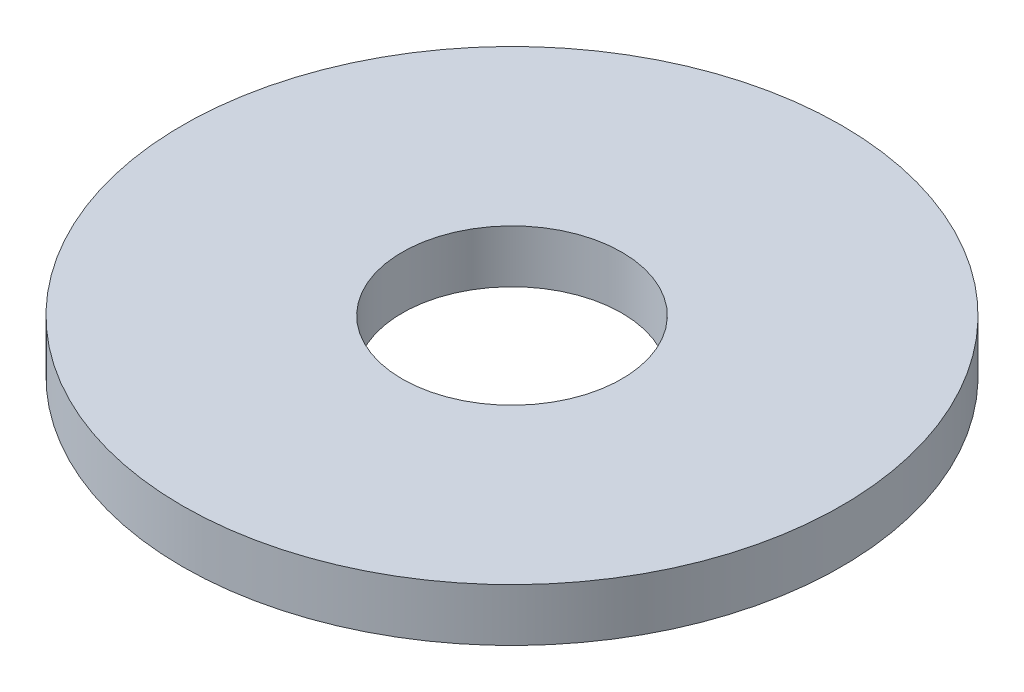
ISO-10303-21;
HEADER;
FILE_DESCRIPTION(('STEP AP214'),'2;1');
FILE_NAME('part.step','',(''),(''),'','','');
FILE_SCHEMA(('AUTOMOTIVE_DESIGN { 1 0 10303 214 1 1 1 1 }'));
ENDSEC;
DATA;
#1=APPLICATION_CONTEXT('core data for automotive mechanical design processes');
#2=APPLICATION_PROTOCOL_DEFINITION('international standard','automotive_design',2000,#1);
#3=PRODUCT_CONTEXT('',#1,'mechanical');
#4=PRODUCT('Part','Part','',(#3));
#5=PRODUCT_RELATED_PRODUCT_CATEGORY('part','',(#4));
#6=PRODUCT_DEFINITION_FORMATION('','',#4);
#7=PRODUCT_DEFINITION_CONTEXT('part definition',#1,'design');
#8=PRODUCT_DEFINITION('design','',#6,#7);
#9=PRODUCT_DEFINITION_SHAPE('','',#8);
#10=(LENGTH_UNIT() NAMED_UNIT(*) SI_UNIT(.MILLI.,.METRE.));
#11=(NAMED_UNIT(*) PLANE_ANGLE_UNIT() SI_UNIT($,.RADIAN.));
#12=(NAMED_UNIT(*) SI_UNIT($,.STERADIAN.) SOLID_ANGLE_UNIT());
#13=UNCERTAINTY_MEASURE_WITH_UNIT(LENGTH_MEASURE(1.E-05),#10,'distance_accuracy_value','');
#14=(GEOMETRIC_REPRESENTATION_CONTEXT(3) GLOBAL_UNCERTAINTY_ASSIGNED_CONTEXT((#13)) GLOBAL_UNIT_ASSIGNED_CONTEXT((#10,
#11,#12)) REPRESENTATION_CONTEXT('',''));
#15=CARTESIAN_POINT('',(0.,0.,0.));
#16=DIRECTION('',(0.,0.,1.));
#17=DIRECTION('',(1.,0.,0.));
#18=AXIS2_PLACEMENT_3D('',#15,#16,#17);
#19=CARTESIAN_POINT('',(0.,1.2,0.));
#20=DIRECTION('',(0.,1.,0.));
#21=DIRECTION('',(0.,0.,1.));
#22=AXIS2_PLACEMENT_3D('',#19,#20,#21);
#23=PLANE('',#22);
#24=CARTESIAN_POINT('',(0.,1.2,0.));
#25=DIRECTION('',(0.,1.,0.));
#26=DIRECTION('',(0.,0.,1.));
#27=AXIS2_PLACEMENT_3D('',#24,#25,#26);
#28=CIRCLE('',#27,7.5);
#29=CARTESIAN_POINT('',(0.,1.2,7.5));
#30=VERTEX_POINT('',#29);
#31=EDGE_CURVE('E10',#30,#30,#28,.T.);
#32=ORIENTED_EDGE('',*,*,#31,.T.);
#33=EDGE_LOOP('',(#32));
#34=FACE_BOUND('',#33,.T.);
#35=CARTESIAN_POINT('',(0.,1.2,0.));
#36=DIRECTION('',(0.,1.,0.));
#37=DIRECTION('',(0.,0.,1.));
#38=AXIS2_PLACEMENT_3D('',#35,#36,#37);
#39=CIRCLE('',#38,2.5);
#40=CARTESIAN_POINT('',(0.,1.2,2.5));
#41=VERTEX_POINT('',#40);
#42=EDGE_CURVE('E50',#41,#41,#39,.T.);
#43=ORIENTED_EDGE('',*,*,#42,.F.);
#44=EDGE_LOOP('',(#43));
#45=FACE_BOUND('',#44,.T.);
#46=ADVANCED_FACE('F37',(#34,#45),#23,.T.);
#47=CARTESIAN_POINT('',(0.,0.,0.));
#48=DIRECTION('',(0.,1.,0.));
#49=DIRECTION('',(0.,0.,1.));
#50=AXIS2_PLACEMENT_3D('',#47,#48,#49);
#51=PLANE('',#50);
#52=CARTESIAN_POINT('',(0.,0.,0.));
#53=DIRECTION('',(0.,1.,0.));
#54=DIRECTION('',(0.,0.,1.));
#55=AXIS2_PLACEMENT_3D('',#52,#53,#54);
#56=CIRCLE('',#55,7.5);
#57=CARTESIAN_POINT('',(0.,0.,7.5));
#58=VERTEX_POINT('',#57);
#59=EDGE_CURVE('E41',#58,#58,#56,.T.);
#60=ORIENTED_EDGE('',*,*,#59,.F.);
#61=EDGE_LOOP('',(#60));
#62=FACE_BOUND('',#61,.T.);
#63=CARTESIAN_POINT('',(0.,0.,0.));
#64=DIRECTION('',(0.,1.,0.));
#65=DIRECTION('',(0.,0.,1.));
#66=AXIS2_PLACEMENT_3D('',#63,#64,#65);
#67=CIRCLE('',#66,2.5);
#68=CARTESIAN_POINT('',(0.,0.,2.5));
#69=VERTEX_POINT('',#68);
#70=EDGE_CURVE('E52',#69,#69,#67,.T.);
#71=ORIENTED_EDGE('',*,*,#70,.T.);
#72=EDGE_LOOP('',(#71));
#73=FACE_BOUND('',#72,.T.);
#74=ADVANCED_FACE('F64',(#62,#73),#51,.F.);
#75=CARTESIAN_POINT('',(0.,1.2,0.));
#76=DIRECTION('',(0.,-1.,0.));
#77=DIRECTION('',(0.,0.,-1.));
#78=AXIS2_PLACEMENT_3D('',#75,#76,#77);
#79=CYLINDRICAL_SURFACE('',#78,7.5);
#80=ORIENTED_EDGE('',*,*,#31,.F.);
#81=EDGE_LOOP('',(#80));
#82=FACE_BOUND('',#81,.T.);
#83=ORIENTED_EDGE('',*,*,#59,.T.);
#84=EDGE_LOOP('',(#83));
#85=FACE_BOUND('',#84,.T.);
#86=ADVANCED_FACE('F39',(#82,#85),#79,.T.);
#87=CARTESIAN_POINT('',(0.,1.2,0.));
#88=DIRECTION('',(0.,-1.,0.));
#89=DIRECTION('',(0.,0.,-1.));
#90=AXIS2_PLACEMENT_3D('',#87,#88,#89);
#91=CYLINDRICAL_SURFACE('',#90,2.5);
#92=ORIENTED_EDGE('',*,*,#42,.T.);
#93=EDGE_LOOP('',(#92));
#94=FACE_BOUND('',#93,.T.);
#95=ORIENTED_EDGE('',*,*,#70,.F.);
#96=EDGE_LOOP('',(#95));
#97=FACE_BOUND('',#96,.T.);
#98=ADVANCED_FACE('F60',(#94,#97),#91,.F.);
#99=CLOSED_SHELL('',(#46,#74,#86,#98));
#100=MANIFOLD_SOLID_BREP('B2',#99);
#101=ADVANCED_BREP_SHAPE_REPRESENTATION('',(#18,#100),#14);
#102=SHAPE_DEFINITION_REPRESENTATION(#9,#101);
ENDSEC;
END-ISO-10303-21;
